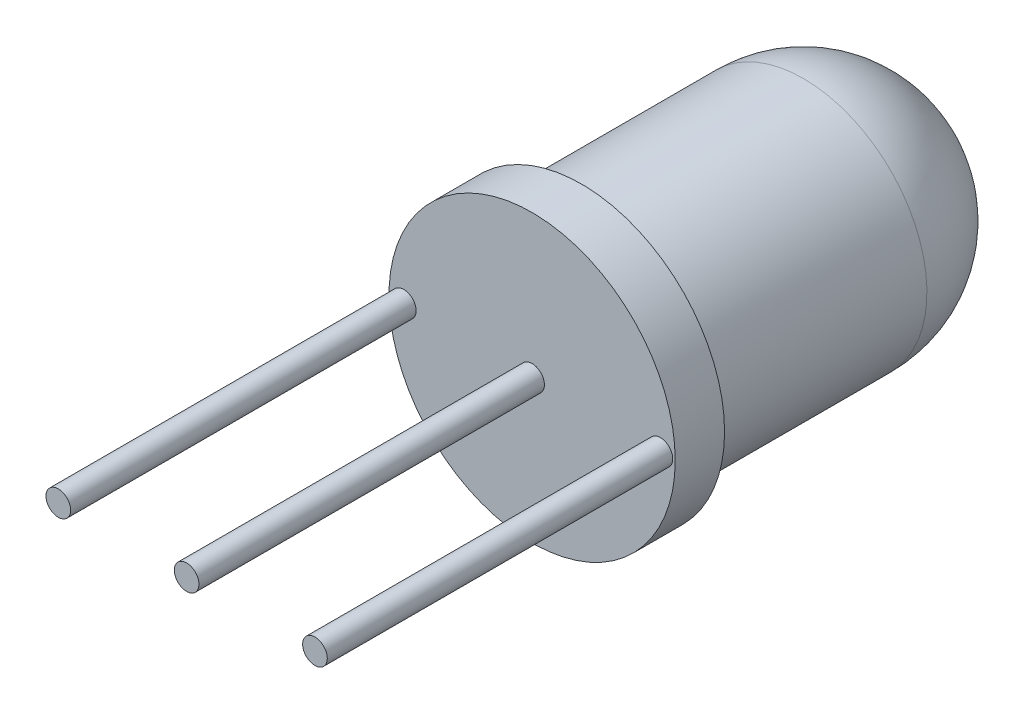
ISO-10303-21;
HEADER;
FILE_DESCRIPTION(('STEP AP214'),'2;1');
FILE_NAME('part.step','',(''),(''),'','','');
FILE_SCHEMA(('AUTOMOTIVE_DESIGN { 1 0 10303 214 1 1 1 1 }'));
ENDSEC;
DATA;
#1=APPLICATION_CONTEXT('core data for automotive mechanical design processes');
#2=APPLICATION_PROTOCOL_DEFINITION('international standard','automotive_design',2000,#1);
#3=PRODUCT_CONTEXT('',#1,'mechanical');
#4=PRODUCT('Part','Part','',(#3));
#5=PRODUCT_RELATED_PRODUCT_CATEGORY('part','',(#4));
#6=PRODUCT_DEFINITION_FORMATION('','',#4);
#7=PRODUCT_DEFINITION_CONTEXT('part definition',#1,'design');
#8=PRODUCT_DEFINITION('design','',#6,#7);
#9=PRODUCT_DEFINITION_SHAPE('','',#8);
#10=(LENGTH_UNIT() NAMED_UNIT(*) SI_UNIT(.MILLI.,.METRE.));
#11=(NAMED_UNIT(*) PLANE_ANGLE_UNIT() SI_UNIT($,.RADIAN.));
#12=(NAMED_UNIT(*) SI_UNIT($,.STERADIAN.) SOLID_ANGLE_UNIT());
#13=UNCERTAINTY_MEASURE_WITH_UNIT(LENGTH_MEASURE(1.E-05),#10,'distance_accuracy_value','');
#14=(GEOMETRIC_REPRESENTATION_CONTEXT(3) GLOBAL_UNCERTAINTY_ASSIGNED_CONTEXT((#13)) GLOBAL_UNIT_ASSIGNED_CONTEXT((#10,
#11,#12)) REPRESENTATION_CONTEXT('',''));
#15=CARTESIAN_POINT('',(0.,0.,0.));
#16=DIRECTION('',(0.,0.,1.));
#17=DIRECTION('',(1.,0.,0.));
#18=AXIS2_PLACEMENT_3D('',#15,#16,#17);
#19=CARTESIAN_POINT('',(0.,0.,5.5));
#20=DIRECTION('',(0.,0.,1.));
#21=DIRECTION('',(1.,0.,0.));
#22=AXIS2_PLACEMENT_3D('',#19,#20,#21);
#23=PLANE('',#22);
#24=CARTESIAN_POINT('',(-2.6,0.,5.5));
#25=DIRECTION('',(0.,0.,1.));
#26=DIRECTION('',(1.,0.,0.));
#27=AXIS2_PLACEMENT_3D('',#24,#25,#26);
#28=CIRCLE('',#27,0.25);
#29=CARTESIAN_POINT('',(-2.35,0.,5.5));
#30=VERTEX_POINT('',#29);
#31=EDGE_CURVE('E10',#30,#30,#28,.T.);
#32=ORIENTED_EDGE('',*,*,#31,.F.);
#33=EDGE_LOOP('',(#32));
#34=FACE_BOUND('',#33,.T.);
#35=CARTESIAN_POINT('',(2.6,0.,5.5));
#36=DIRECTION('',(0.,0.,1.));
#37=DIRECTION('',(1.,0.,0.));
#38=AXIS2_PLACEMENT_3D('',#35,#36,#37);
#39=CIRCLE('',#38,0.25);
#40=CARTESIAN_POINT('',(2.85,0.,5.5));
#41=VERTEX_POINT('',#40);
#42=EDGE_CURVE('E55',#41,#41,#39,.T.);
#43=ORIENTED_EDGE('',*,*,#42,.F.);
#44=EDGE_LOOP('',(#43));
#45=FACE_BOUND('',#44,.T.);
#46=CARTESIAN_POINT('',(0.,0.,5.5));
#47=DIRECTION('',(0.,0.,1.));
#48=DIRECTION('',(1.,0.,0.));
#49=AXIS2_PLACEMENT_3D('',#46,#47,#48);
#50=CIRCLE('',#49,2.9);
#51=CARTESIAN_POINT('',(2.9,0.,5.5));
#52=VERTEX_POINT('',#51);
#53=EDGE_CURVE('E46',#52,#52,#50,.T.);
#54=ORIENTED_EDGE('',*,*,#53,.T.);
#55=EDGE_LOOP('',(#54));
#56=FACE_BOUND('',#55,.T.);
#57=CARTESIAN_POINT('',(0.,0.,5.5));
#58=DIRECTION('',(0.,0.,1.));
#59=DIRECTION('',(1.,0.,0.));
#60=AXIS2_PLACEMENT_3D('',#57,#58,#59);
#61=CIRCLE('',#60,0.25);
#62=CARTESIAN_POINT('',(0.25,0.,5.5));
#63=VERTEX_POINT('',#62);
#64=EDGE_CURVE('E61',#63,#63,#61,.T.);
#65=ORIENTED_EDGE('',*,*,#64,.F.);
#66=EDGE_LOOP('',(#65));
#67=FACE_BOUND('',#66,.T.);
#68=ADVANCED_FACE('F31',(#34,#45,#56,#67),#23,.T.);
#69=CARTESIAN_POINT('',(0.,0.,5.5));
#70=DIRECTION('',(0.,0.,-1.));
#71=DIRECTION('',(-1.,0.,0.));
#72=AXIS2_PLACEMENT_3D('',#69,#70,#71);
#73=CYLINDRICAL_SURFACE('',#72,2.5);
#74=CARTESIAN_POINT('',(0.,0.,0.));
#75=DIRECTION('',(0.,0.,-1.));
#76=DIRECTION('',(-1.,0.,0.));
#77=AXIS2_PLACEMENT_3D('',#74,#75,#76);
#78=CIRCLE('',#77,2.5);
#79=CARTESIAN_POINT('',(-2.5,0.,0.));
#80=VERTEX_POINT('',#79);
#81=EDGE_CURVE('E50',#80,#80,#78,.T.);
#82=ORIENTED_EDGE('',*,*,#81,.F.);
#83=EDGE_LOOP('',(#82));
#84=FACE_BOUND('',#83,.T.);
#85=CARTESIAN_POINT('',(0.,0.,4.5));
#86=DIRECTION('',(0.,0.,1.));
#87=DIRECTION('',(1.,0.,0.));
#88=AXIS2_PLACEMENT_3D('',#85,#86,#87);
#89=CIRCLE('',#88,2.5);
#90=CARTESIAN_POINT('',(2.5,0.,4.5));
#91=VERTEX_POINT('',#90);
#92=EDGE_CURVE('E38',#91,#91,#89,.T.);
#93=ORIENTED_EDGE('',*,*,#92,.F.);
#94=EDGE_LOOP('',(#93));
#95=FACE_BOUND('',#94,.T.);
#96=ADVANCED_FACE('F33',(#84,#95),#73,.T.);
#97=CARTESIAN_POINT('',(0.,0.,4.5));
#98=DIRECTION('',(0.,0.,1.));
#99=DIRECTION('',(1.,0.,0.));
#100=AXIS2_PLACEMENT_3D('',#97,#98,#99);
#101=PLANE('',#100);
#102=CARTESIAN_POINT('',(0.,0.,4.5));
#103=DIRECTION('',(0.,0.,1.));
#104=DIRECTION('',(1.,0.,0.));
#105=AXIS2_PLACEMENT_3D('',#102,#103,#104);
#106=CIRCLE('',#105,2.9);
#107=CARTESIAN_POINT('',(2.9,0.,4.5));
#108=VERTEX_POINT('',#107);
#109=EDGE_CURVE('E42',#108,#108,#106,.T.);
#110=ORIENTED_EDGE('',*,*,#109,.F.);
#111=EDGE_LOOP('',(#110));
#112=FACE_BOUND('',#111,.T.);
#113=ORIENTED_EDGE('',*,*,#92,.T.);
#114=EDGE_LOOP('',(#113));
#115=FACE_BOUND('',#114,.T.);
#116=ADVANCED_FACE('F85',(#112,#115),#101,.F.);
#117=CARTESIAN_POINT('',(0.,0.,4.5));
#118=DIRECTION('',(0.,0.,1.));
#119=DIRECTION('',(1.,0.,0.));
#120=AXIS2_PLACEMENT_3D('',#117,#118,#119);
#121=CYLINDRICAL_SURFACE('',#120,2.9);
#122=ORIENTED_EDGE('',*,*,#109,.T.);
#123=EDGE_LOOP('',(#122));
#124=FACE_BOUND('',#123,.T.);
#125=ORIENTED_EDGE('',*,*,#53,.F.);
#126=EDGE_LOOP('',(#125));
#127=FACE_BOUND('',#126,.T.);
#128=ADVANCED_FACE('F89',(#124,#127),#121,.T.);
#129=CARTESIAN_POINT('',(0.,0.,0.));
#130=DIRECTION('',(0.,0.,-1.));
#131=DIRECTION('',(0.,1.,0.));
#132=AXIS2_PLACEMENT_3D('',#129,#130,#131);
#133=SPHERICAL_SURFACE('',#132,2.5);
#134=ORIENTED_EDGE('',*,*,#81,.T.);
#135=EDGE_LOOP('',(#134));
#136=FACE_BOUND('',#135,.T.);
#137=ADVANCED_FACE('F92',(#136),#133,.T.);
#138=CARTESIAN_POINT('',(2.6,0.,12.5));
#139=DIRECTION('',(0.,0.,-1.));
#140=DIRECTION('',(-1.,0.,0.));
#141=AXIS2_PLACEMENT_3D('',#138,#139,#140);
#142=CYLINDRICAL_SURFACE('',#141,0.25);
#143=CARTESIAN_POINT('',(2.6,0.,12.5));
#144=DIRECTION('',(0.,0.,1.));
#145=DIRECTION('',(1.,0.,0.));
#146=AXIS2_PLACEMENT_3D('',#143,#144,#145);
#147=CIRCLE('',#146,0.25);
#148=CARTESIAN_POINT('',(2.85,0.,12.5));
#149=VERTEX_POINT('',#148);
#150=EDGE_CURVE('E54',#149,#149,#147,.T.);
#151=ORIENTED_EDGE('',*,*,#150,.F.);
#152=EDGE_LOOP('',(#151));
#153=FACE_BOUND('',#152,.T.);
#154=ORIENTED_EDGE('',*,*,#42,.T.);
#155=EDGE_LOOP('',(#154));
#156=FACE_BOUND('',#155,.T.);
#157=ADVANCED_FACE('F99',(#153,#156),#142,.T.);
#158=CARTESIAN_POINT('',(0.,0.,12.5));
#159=DIRECTION('',(0.,0.,1.));
#160=DIRECTION('',(1.,0.,0.));
#161=AXIS2_PLACEMENT_3D('',#158,#159,#160);
#162=PLANE('',#161);
#163=ORIENTED_EDGE('',*,*,#150,.T.);
#164=EDGE_LOOP('',(#163));
#165=FACE_BOUND('',#164,.T.);
#166=ADVANCED_FACE('F103',(#165),#162,.T.);
#167=CARTESIAN_POINT('',(0.,0.,12.5));
#168=DIRECTION('',(0.,0.,-1.));
#169=DIRECTION('',(-1.,0.,0.));
#170=AXIS2_PLACEMENT_3D('',#167,#168,#169);
#171=CYLINDRICAL_SURFACE('',#170,0.25);
#172=CARTESIAN_POINT('',(0.,0.,12.5));
#173=DIRECTION('',(0.,0.,1.));
#174=DIRECTION('',(1.,0.,0.));
#175=AXIS2_PLACEMENT_3D('',#172,#173,#174);
#176=CIRCLE('',#175,0.25);
#177=CARTESIAN_POINT('',(0.25,0.,12.5));
#178=VERTEX_POINT('',#177);
#179=EDGE_CURVE('E58',#178,#178,#176,.T.);
#180=ORIENTED_EDGE('',*,*,#179,.F.);
#181=EDGE_LOOP('',(#180));
#182=FACE_BOUND('',#181,.T.);
#183=ORIENTED_EDGE('',*,*,#64,.T.);
#184=EDGE_LOOP('',(#183));
#185=FACE_BOUND('',#184,.T.);
#186=ADVANCED_FACE('F107',(#182,#185),#171,.T.);
#187=CARTESIAN_POINT('',(0.,0.,12.5));
#188=DIRECTION('',(0.,0.,1.));
#189=DIRECTION('',(1.,0.,0.));
#190=AXIS2_PLACEMENT_3D('',#187,#188,#189);
#191=PLANE('',#190);
#192=ORIENTED_EDGE('',*,*,#179,.T.);
#193=EDGE_LOOP('',(#192));
#194=FACE_BOUND('',#193,.T.);
#195=ADVANCED_FACE('F78',(#194),#191,.T.);
#196=CARTESIAN_POINT('',(-2.6,0.,12.5));
#197=DIRECTION('',(0.,0.,-1.));
#198=DIRECTION('',(-1.,0.,0.));
#199=AXIS2_PLACEMENT_3D('',#196,#197,#198);
#200=CYLINDRICAL_SURFACE('',#199,0.25);
#201=CARTESIAN_POINT('',(-2.6,0.,12.5));
#202=DIRECTION('',(0.,0.,1.));
#203=DIRECTION('',(1.,0.,0.));
#204=AXIS2_PLACEMENT_3D('',#201,#202,#203);
#205=CIRCLE('',#204,0.25);
#206=CARTESIAN_POINT('',(-2.35,0.,12.5));
#207=VERTEX_POINT('',#206);
#208=EDGE_CURVE('E64',#207,#207,#205,.F.);
#209=ORIENTED_EDGE('',*,*,#208,.T.);
#210=EDGE_LOOP('',(#209));
#211=FACE_BOUND('',#210,.T.);
#212=ORIENTED_EDGE('',*,*,#31,.T.);
#213=EDGE_LOOP('',(#212));
#214=FACE_BOUND('',#213,.T.);
#215=ADVANCED_FACE('F70',(#211,#214),#200,.T.);
#216=CARTESIAN_POINT('',(0.,0.,12.5));
#217=DIRECTION('',(0.,0.,1.));
#218=DIRECTION('',(1.,0.,0.));
#219=AXIS2_PLACEMENT_3D('',#216,#217,#218);
#220=PLANE('',#219);
#221=ORIENTED_EDGE('',*,*,#208,.F.);
#222=EDGE_LOOP('',(#221));
#223=FACE_BOUND('',#222,.T.);
#224=ADVANCED_FACE('F72',(#223),#220,.T.);
#225=CLOSED_SHELL('',(#68,#96,#116,#128,#137,#157,#166,#186,#195,#215,#224));
#226=MANIFOLD_SOLID_BREP('B2',#225);
#227=ADVANCED_BREP_SHAPE_REPRESENTATION('',(#18,#226),#14);
#228=SHAPE_DEFINITION_REPRESENTATION(#9,#227);
ENDSEC;
END-ISO-10303-21;
